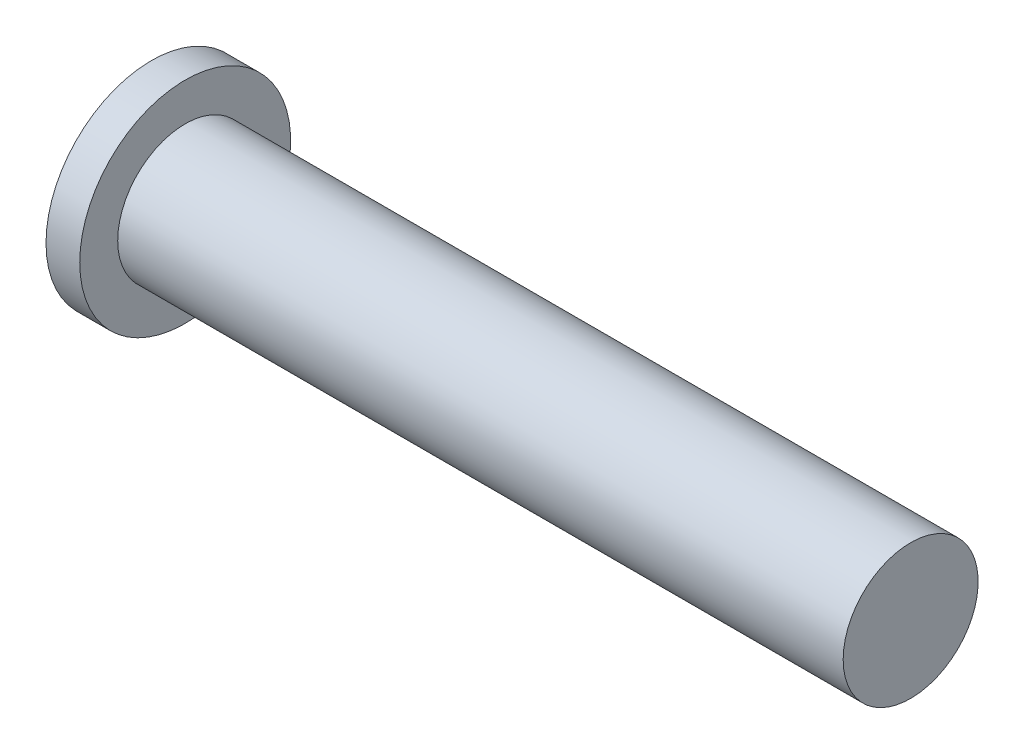
ISO-10303-21;
HEADER;
FILE_DESCRIPTION(('STEP AP214'),'2;1');
FILE_NAME('part.step','',(''),(''),'','','');
FILE_SCHEMA(('AUTOMOTIVE_DESIGN { 1 0 10303 214 1 1 1 1 }'));
ENDSEC;
DATA;
#1=APPLICATION_CONTEXT('core data for automotive mechanical design processes');
#2=APPLICATION_PROTOCOL_DEFINITION('international standard','automotive_design',2000,#1);
#3=PRODUCT_CONTEXT('',#1,'mechanical');
#4=PRODUCT('Part','Part','',(#3));
#5=PRODUCT_RELATED_PRODUCT_CATEGORY('part','',(#4));
#6=PRODUCT_DEFINITION_FORMATION('','',#4);
#7=PRODUCT_DEFINITION_CONTEXT('part definition',#1,'design');
#8=PRODUCT_DEFINITION('design','',#6,#7);
#9=PRODUCT_DEFINITION_SHAPE('','',#8);
#10=(LENGTH_UNIT() NAMED_UNIT(*) SI_UNIT(.MILLI.,.METRE.));
#11=(NAMED_UNIT(*) PLANE_ANGLE_UNIT() SI_UNIT($,.RADIAN.));
#12=(NAMED_UNIT(*) SI_UNIT($,.STERADIAN.) SOLID_ANGLE_UNIT());
#13=UNCERTAINTY_MEASURE_WITH_UNIT(LENGTH_MEASURE(1.E-05),#10,'distance_accuracy_value','');
#14=(GEOMETRIC_REPRESENTATION_CONTEXT(3) GLOBAL_UNCERTAINTY_ASSIGNED_CONTEXT((#13)) GLOBAL_UNIT_ASSIGNED_CONTEXT((#10,
#11,#12)) REPRESENTATION_CONTEXT('',''));
#15=CARTESIAN_POINT('',(0.,0.,0.));
#16=DIRECTION('',(0.,0.,1.));
#17=DIRECTION('',(1.,0.,0.));
#18=AXIS2_PLACEMENT_3D('',#15,#16,#17);
#19=CARTESIAN_POINT('',(0.,0.,0.));
#20=DIRECTION('',(1.,0.,0.));
#21=DIRECTION('',(0.,0.,-1.));
#22=AXIS2_PLACEMENT_3D('',#19,#20,#21);
#23=PLANE('',#22);
#24=CARTESIAN_POINT('',(0.,0.,0.));
#25=DIRECTION('',(-1.,0.,0.));
#26=DIRECTION('',(0.,0.,1.));
#27=AXIS2_PLACEMENT_3D('',#24,#25,#26);
#28=CIRCLE('',#27,6.25);
#29=CARTESIAN_POINT('',(0.,0.,6.25));
#30=VERTEX_POINT('',#29);
#31=EDGE_CURVE('E10',#30,#30,#28,.T.);
#32=ORIENTED_EDGE('',*,*,#31,.T.);
#33=EDGE_LOOP('',(#32));
#34=FACE_BOUND('',#33,.T.);
#35=ADVANCED_FACE('F31',(#34),#23,.F.);
#36=CARTESIAN_POINT('',(0.,0.,0.));
#37=DIRECTION('',(-1.,0.,0.));
#38=DIRECTION('',(0.,0.,1.));
#39=AXIS2_PLACEMENT_3D('',#36,#37,#38);
#40=CYLINDRICAL_SURFACE('',#39,6.25);
#41=ORIENTED_EDGE('',*,*,#31,.F.);
#42=EDGE_LOOP('',(#41));
#43=FACE_BOUND('',#42,.T.);
#44=CARTESIAN_POINT('',(2.,0.,0.));
#45=DIRECTION('',(-1.,0.,0.));
#46=DIRECTION('',(0.,0.,1.));
#47=AXIS2_PLACEMENT_3D('',#44,#45,#46);
#48=CIRCLE('',#47,6.25);
#49=CARTESIAN_POINT('',(2.,0.,6.25));
#50=VERTEX_POINT('',#49);
#51=EDGE_CURVE('E37',#50,#50,#48,.T.);
#52=ORIENTED_EDGE('',*,*,#51,.T.);
#53=EDGE_LOOP('',(#52));
#54=FACE_BOUND('',#53,.T.);
#55=ADVANCED_FACE('F63',(#43,#54),#40,.T.);
#56=CARTESIAN_POINT('',(2.,0.,-6.25));
#57=DIRECTION('',(-1.,0.,0.));
#58=DIRECTION('',(0.,0.,1.));
#59=AXIS2_PLACEMENT_3D('',#56,#57,#58);
#60=PLANE('',#59);
#61=ORIENTED_EDGE('',*,*,#51,.F.);
#62=EDGE_LOOP('',(#61));
#63=FACE_BOUND('',#62,.T.);
#64=CARTESIAN_POINT('',(2.,0.,0.));
#65=DIRECTION('',(-1.,0.,0.));
#66=DIRECTION('',(0.,0.,1.));
#67=AXIS2_PLACEMENT_3D('',#64,#65,#66);
#68=CIRCLE('',#67,3.99999999999999);
#69=CARTESIAN_POINT('',(2.,0.,3.99999999999999));
#70=VERTEX_POINT('',#69);
#71=EDGE_CURVE('E41',#70,#70,#68,.T.);
#72=ORIENTED_EDGE('',*,*,#71,.T.);
#73=EDGE_LOOP('',(#72));
#74=FACE_BOUND('',#73,.T.);
#75=ADVANCED_FACE('F59',(#63,#74),#60,.F.);
#76=CARTESIAN_POINT('',(0.,0.,0.));
#77=DIRECTION('',(-1.,0.,0.));
#78=DIRECTION('',(0.,0.,1.));
#79=AXIS2_PLACEMENT_3D('',#76,#77,#78);
#80=CYLINDRICAL_SURFACE('',#79,3.99999999999999);
#81=ORIENTED_EDGE('',*,*,#71,.F.);
#82=EDGE_LOOP('',(#81));
#83=FACE_BOUND('',#82,.T.);
#84=CARTESIAN_POINT('',(45.,0.,0.));
#85=DIRECTION('',(-1.,0.,0.));
#86=DIRECTION('',(0.,0.,1.));
#87=AXIS2_PLACEMENT_3D('',#84,#85,#86);
#88=CIRCLE('',#87,3.99999999999999);
#89=CARTESIAN_POINT('',(45.,0.,3.99999999999999));
#90=VERTEX_POINT('',#89);
#91=EDGE_CURVE('E45',#90,#90,#88,.T.);
#92=ORIENTED_EDGE('',*,*,#91,.T.);
#93=EDGE_LOOP('',(#92));
#94=FACE_BOUND('',#93,.T.);
#95=ADVANCED_FACE('F51',(#83,#94),#80,.T.);
#96=CARTESIAN_POINT('',(45.,0.,-3.99999999999999));
#97=DIRECTION('',(-1.,0.,0.));
#98=DIRECTION('',(0.,0.,1.));
#99=AXIS2_PLACEMENT_3D('',#96,#97,#98);
#100=PLANE('',#99);
#101=ORIENTED_EDGE('',*,*,#91,.F.);
#102=EDGE_LOOP('',(#101));
#103=FACE_BOUND('',#102,.T.);
#104=ADVANCED_FACE('F53',(#103),#100,.F.);
#105=CLOSED_SHELL('',(#35,#55,#75,#95,#104));
#106=MANIFOLD_SOLID_BREP('B2',#105);
#107=ADVANCED_BREP_SHAPE_REPRESENTATION('',(#18,#106),#14);
#108=SHAPE_DEFINITION_REPRESENTATION(#9,#107);
ENDSEC;
END-ISO-10303-21;
